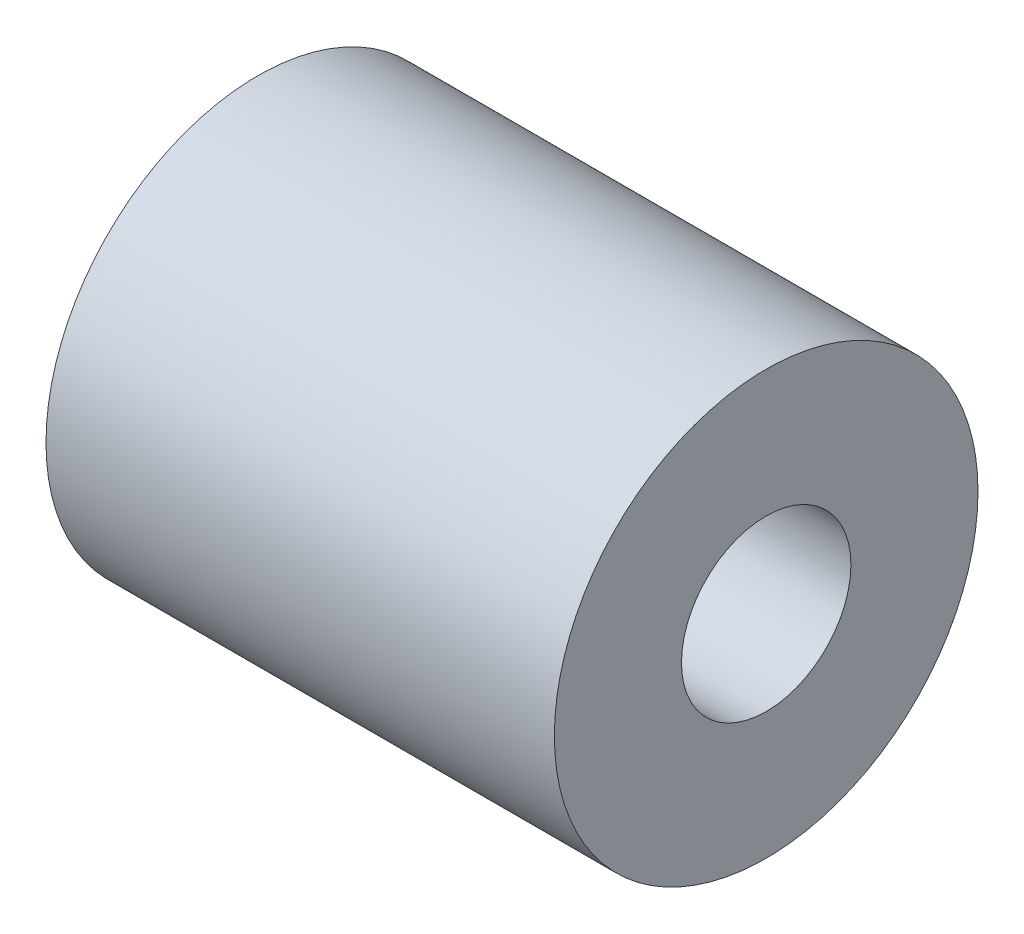
ISO-10303-21;
HEADER;
FILE_DESCRIPTION(('STEP AP214'),'2;1');
FILE_NAME('part.step','',(''),(''),'','','');
FILE_SCHEMA(('AUTOMOTIVE_DESIGN { 1 0 10303 214 1 1 1 1 }'));
ENDSEC;
DATA;
#1=APPLICATION_CONTEXT('core data for automotive mechanical design processes');
#2=APPLICATION_PROTOCOL_DEFINITION('international standard','automotive_design',2000,#1);
#3=PRODUCT_CONTEXT('',#1,'mechanical');
#4=PRODUCT('Part','Part','',(#3));
#5=PRODUCT_RELATED_PRODUCT_CATEGORY('part','',(#4));
#6=PRODUCT_DEFINITION_FORMATION('','',#4);
#7=PRODUCT_DEFINITION_CONTEXT('part definition',#1,'design');
#8=PRODUCT_DEFINITION('design','',#6,#7);
#9=PRODUCT_DEFINITION_SHAPE('','',#8);
#10=(LENGTH_UNIT() NAMED_UNIT(*) SI_UNIT(.MILLI.,.METRE.));
#11=(NAMED_UNIT(*) PLANE_ANGLE_UNIT() SI_UNIT($,.RADIAN.));
#12=(NAMED_UNIT(*) SI_UNIT($,.STERADIAN.) SOLID_ANGLE_UNIT());
#13=UNCERTAINTY_MEASURE_WITH_UNIT(LENGTH_MEASURE(1.E-05),#10,'distance_accuracy_value','');
#14=(GEOMETRIC_REPRESENTATION_CONTEXT(3) GLOBAL_UNCERTAINTY_ASSIGNED_CONTEXT((#13)) GLOBAL_UNIT_ASSIGNED_CONTEXT((#10,
#11,#12)) REPRESENTATION_CONTEXT('',''));
#15=CARTESIAN_POINT('',(0.,0.,0.));
#16=DIRECTION('',(0.,0.,1.));
#17=DIRECTION('',(1.,0.,0.));
#18=AXIS2_PLACEMENT_3D('',#15,#16,#17);
#19=CARTESIAN_POINT('',(0.,2.5,0.));
#20=DIRECTION('',(1.,0.,0.));
#21=DIRECTION('',(0.,0.,-1.));
#22=AXIS2_PLACEMENT_3D('',#19,#20,#21);
#23=PLANE('',#22);
#24=CARTESIAN_POINT('',(0.,0.,0.));
#25=DIRECTION('',(-1.,0.,0.));
#26=DIRECTION('',(0.,0.,1.));
#27=AXIS2_PLACEMENT_3D('',#24,#25,#26);
#28=CIRCLE('',#27,2.5);
#29=CARTESIAN_POINT('',(0.,0.,2.5));
#30=VERTEX_POINT('',#29);
#31=EDGE_CURVE('E59',#30,#30,#28,.T.);
#32=ORIENTED_EDGE('',*,*,#31,.F.);
#33=EDGE_LOOP('',(#32));
#34=FACE_BOUND('',#33,.T.);
#35=CARTESIAN_POINT('',(0.,0.,0.));
#36=DIRECTION('',(-1.,0.,0.));
#37=DIRECTION('',(0.,0.,1.));
#38=AXIS2_PLACEMENT_3D('',#35,#36,#37);
#39=CIRCLE('',#38,10.);
#40=CARTESIAN_POINT('',(0.,0.,10.));
#41=VERTEX_POINT('',#40);
#42=EDGE_CURVE('E10',#41,#41,#39,.T.);
#43=ORIENTED_EDGE('',*,*,#42,.T.);
#44=EDGE_LOOP('',(#43));
#45=FACE_BOUND('',#44,.T.);
#46=ADVANCED_FACE('F37',(#34,#45),#23,.F.);
#47=CARTESIAN_POINT('',(0.,0.,0.));
#48=DIRECTION('',(-1.,0.,0.));
#49=DIRECTION('',(0.,0.,1.));
#50=AXIS2_PLACEMENT_3D('',#47,#48,#49);
#51=CYLINDRICAL_SURFACE('',#50,10.);
#52=ORIENTED_EDGE('',*,*,#42,.F.);
#53=EDGE_LOOP('',(#52));
#54=FACE_BOUND('',#53,.T.);
#55=CARTESIAN_POINT('',(24.,0.,0.));
#56=DIRECTION('',(-1.,0.,0.));
#57=DIRECTION('',(0.,0.,1.));
#58=AXIS2_PLACEMENT_3D('',#55,#56,#57);
#59=CIRCLE('',#58,10.);
#60=CARTESIAN_POINT('',(24.,0.,10.));
#61=VERTEX_POINT('',#60);
#62=EDGE_CURVE('E43',#61,#61,#59,.T.);
#63=ORIENTED_EDGE('',*,*,#62,.T.);
#64=EDGE_LOOP('',(#63));
#65=FACE_BOUND('',#64,.T.);
#66=ADVANCED_FACE('F66',(#54,#65),#51,.T.);
#67=CARTESIAN_POINT('',(24.,10.,0.));
#68=DIRECTION('',(-1.,0.,0.));
#69=DIRECTION('',(0.,0.,1.));
#70=AXIS2_PLACEMENT_3D('',#67,#68,#69);
#71=PLANE('',#70);
#72=ORIENTED_EDGE('',*,*,#62,.F.);
#73=EDGE_LOOP('',(#72));
#74=FACE_BOUND('',#73,.T.);
#75=CARTESIAN_POINT('',(24.,0.,0.));
#76=DIRECTION('',(-1.,0.,0.));
#77=DIRECTION('',(0.,0.,1.));
#78=AXIS2_PLACEMENT_3D('',#75,#76,#77);
#79=CIRCLE('',#78,4.);
#80=CARTESIAN_POINT('',(24.,0.,4.));
#81=VERTEX_POINT('',#80);
#82=EDGE_CURVE('E47',#81,#81,#79,.T.);
#83=ORIENTED_EDGE('',*,*,#82,.T.);
#84=EDGE_LOOP('',(#83));
#85=FACE_BOUND('',#84,.T.);
#86=ADVANCED_FACE('F70',(#74,#85),#71,.F.);
#87=CARTESIAN_POINT('',(0.,0.,0.));
#88=DIRECTION('',(-1.,0.,0.));
#89=DIRECTION('',(0.,0.,1.));
#90=AXIS2_PLACEMENT_3D('',#87,#88,#89);
#91=CYLINDRICAL_SURFACE('',#90,4.);
#92=ORIENTED_EDGE('',*,*,#82,.F.);
#93=EDGE_LOOP('',(#92));
#94=FACE_BOUND('',#93,.T.);
#95=CARTESIAN_POINT('',(12.,0.,0.));
#96=DIRECTION('',(-1.,0.,0.));
#97=DIRECTION('',(0.,0.,1.));
#98=AXIS2_PLACEMENT_3D('',#95,#96,#97);
#99=CIRCLE('',#98,4.);
#100=CARTESIAN_POINT('',(12.,0.,4.));
#101=VERTEX_POINT('',#100);
#102=EDGE_CURVE('E51',#101,#101,#99,.T.);
#103=ORIENTED_EDGE('',*,*,#102,.T.);
#104=EDGE_LOOP('',(#103));
#105=FACE_BOUND('',#104,.T.);
#106=ADVANCED_FACE('F75',(#94,#105),#91,.F.);
#107=CARTESIAN_POINT('',(12.,4.,0.));
#108=DIRECTION('',(-1.,0.,0.));
#109=DIRECTION('',(0.,0.,1.));
#110=AXIS2_PLACEMENT_3D('',#107,#108,#109);
#111=PLANE('',#110);
#112=ORIENTED_EDGE('',*,*,#102,.F.);
#113=EDGE_LOOP('',(#112));
#114=FACE_BOUND('',#113,.T.);
#115=CARTESIAN_POINT('',(12.,0.,0.));
#116=DIRECTION('',(-1.,0.,0.));
#117=DIRECTION('',(0.,0.,1.));
#118=AXIS2_PLACEMENT_3D('',#115,#116,#117);
#119=CIRCLE('',#118,2.5);
#120=CARTESIAN_POINT('',(12.,0.,2.5));
#121=VERTEX_POINT('',#120);
#122=EDGE_CURVE('E56',#121,#121,#119,.T.);
#123=ORIENTED_EDGE('',*,*,#122,.T.);
#124=EDGE_LOOP('',(#123));
#125=FACE_BOUND('',#124,.T.);
#126=ADVANCED_FACE('F81',(#114,#125),#111,.F.);
#127=CARTESIAN_POINT('',(0.,0.,0.));
#128=DIRECTION('',(-1.,0.,0.));
#129=DIRECTION('',(0.,0.,1.));
#130=AXIS2_PLACEMENT_3D('',#127,#128,#129);
#131=CYLINDRICAL_SURFACE('',#130,2.5);
#132=ORIENTED_EDGE('',*,*,#122,.F.);
#133=EDGE_LOOP('',(#132));
#134=FACE_BOUND('',#133,.T.);
#135=ORIENTED_EDGE('',*,*,#31,.T.);
#136=EDGE_LOOP('',(#135));
#137=FACE_BOUND('',#136,.T.);
#138=ADVANCED_FACE('F63',(#134,#137),#131,.F.);
#139=CLOSED_SHELL('',(#46,#66,#86,#106,#126,#138));
#140=MANIFOLD_SOLID_BREP('B2',#139);
#141=ADVANCED_BREP_SHAPE_REPRESENTATION('',(#18,#140),#14);
#142=SHAPE_DEFINITION_REPRESENTATION(#9,#141);
ENDSEC;
END-ISO-10303-21;
